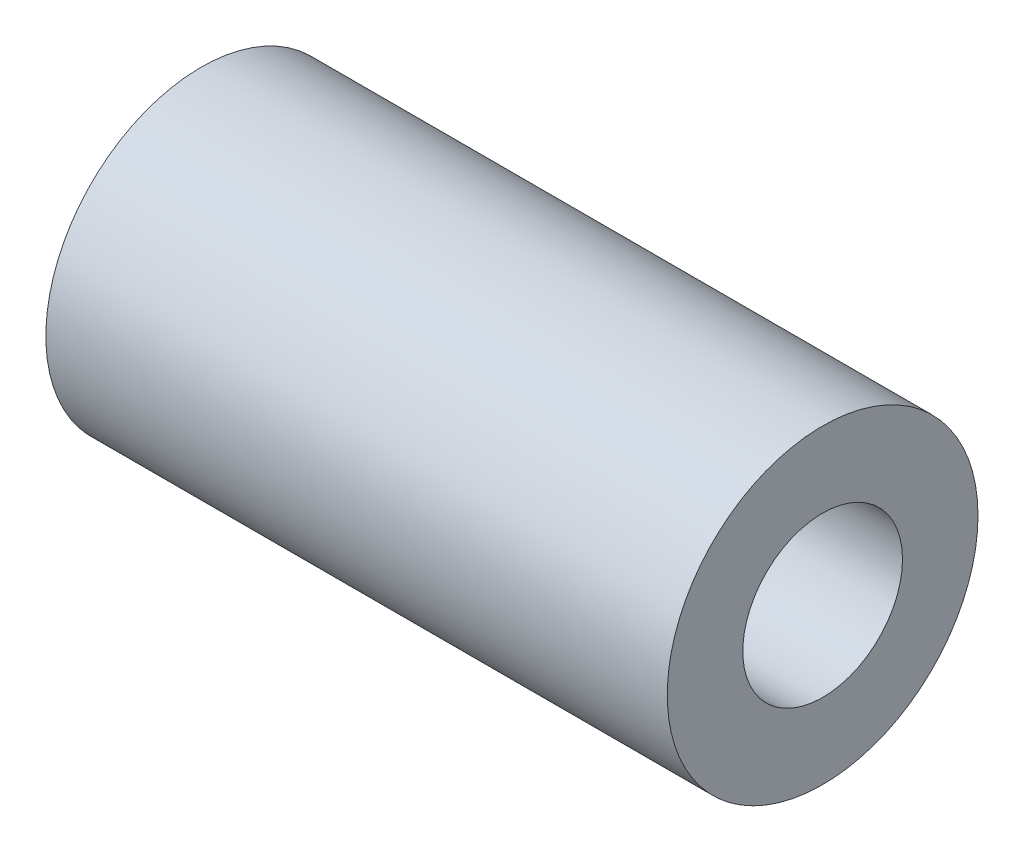
ISO-10303-21;
HEADER;
FILE_DESCRIPTION(('STEP AP214'),'2;1');
FILE_NAME('part.step','',(''),(''),'','','');
FILE_SCHEMA(('AUTOMOTIVE_DESIGN { 1 0 10303 214 1 1 1 1 }'));
ENDSEC;
DATA;
#1=APPLICATION_CONTEXT('core data for automotive mechanical design processes');
#2=APPLICATION_PROTOCOL_DEFINITION('international standard','automotive_design',2000,#1);
#3=PRODUCT_CONTEXT('',#1,'mechanical');
#4=PRODUCT('Part','Part','',(#3));
#5=PRODUCT_RELATED_PRODUCT_CATEGORY('part','',(#4));
#6=PRODUCT_DEFINITION_FORMATION('','',#4);
#7=PRODUCT_DEFINITION_CONTEXT('part definition',#1,'design');
#8=PRODUCT_DEFINITION('design','',#6,#7);
#9=PRODUCT_DEFINITION_SHAPE('','',#8);
#10=(LENGTH_UNIT() NAMED_UNIT(*) SI_UNIT(.MILLI.,.METRE.));
#11=(NAMED_UNIT(*) PLANE_ANGLE_UNIT() SI_UNIT($,.RADIAN.));
#12=(NAMED_UNIT(*) SI_UNIT($,.STERADIAN.) SOLID_ANGLE_UNIT());
#13=UNCERTAINTY_MEASURE_WITH_UNIT(LENGTH_MEASURE(1.E-05),#10,'distance_accuracy_value','');
#14=(GEOMETRIC_REPRESENTATION_CONTEXT(3) GLOBAL_UNCERTAINTY_ASSIGNED_CONTEXT((#13)) GLOBAL_UNIT_ASSIGNED_CONTEXT((#10,
#11,#12)) REPRESENTATION_CONTEXT('',''));
#15=CARTESIAN_POINT('',(0.,0.,0.));
#16=DIRECTION('',(0.,0.,1.));
#17=DIRECTION('',(1.,0.,0.));
#18=AXIS2_PLACEMENT_3D('',#15,#16,#17);
#19=CARTESIAN_POINT('',(25.4,0.,0.));
#20=DIRECTION('',(1.,0.,0.));
#21=DIRECTION('',(0.,0.,-1.));
#22=AXIS2_PLACEMENT_3D('',#19,#20,#21);
#23=PLANE('',#22);
#24=CARTESIAN_POINT('',(25.4,0.,0.));
#25=DIRECTION('',(1.,0.,0.));
#26=DIRECTION('',(0.,0.,-1.));
#27=AXIS2_PLACEMENT_3D('',#24,#25,#26);
#28=CIRCLE('',#27,6.35);
#29=CARTESIAN_POINT('',(25.4,0.,-6.35));
#30=VERTEX_POINT('',#29);
#31=EDGE_CURVE('E10',#30,#30,#28,.T.);
#32=ORIENTED_EDGE('',*,*,#31,.T.);
#33=EDGE_LOOP('',(#32));
#34=FACE_BOUND('',#33,.T.);
#35=CARTESIAN_POINT('',(25.4,0.,0.));
#36=DIRECTION('',(1.,0.,0.));
#37=DIRECTION('',(0.,0.,-1.));
#38=AXIS2_PLACEMENT_3D('',#35,#36,#37);
#39=CIRCLE('',#38,3.2639);
#40=CARTESIAN_POINT('',(25.4,0.,-3.2639));
#41=VERTEX_POINT('',#40);
#42=EDGE_CURVE('E41',#41,#41,#39,.T.);
#43=ORIENTED_EDGE('',*,*,#42,.F.);
#44=EDGE_LOOP('',(#43));
#45=FACE_BOUND('',#44,.T.);
#46=ADVANCED_FACE('F30',(#34,#45),#23,.T.);
#47=CARTESIAN_POINT('',(0.,0.,0.));
#48=DIRECTION('',(1.,0.,0.));
#49=DIRECTION('',(0.,0.,-1.));
#50=AXIS2_PLACEMENT_3D('',#47,#48,#49);
#51=PLANE('',#50);
#52=CARTESIAN_POINT('',(0.,0.,0.));
#53=DIRECTION('',(1.,0.,0.));
#54=DIRECTION('',(0.,0.,-1.));
#55=AXIS2_PLACEMENT_3D('',#52,#53,#54);
#56=CIRCLE('',#55,6.35);
#57=CARTESIAN_POINT('',(0.,0.,-6.35));
#58=VERTEX_POINT('',#57);
#59=EDGE_CURVE('E34',#58,#58,#56,.T.);
#60=ORIENTED_EDGE('',*,*,#59,.F.);
#61=EDGE_LOOP('',(#60));
#62=FACE_BOUND('',#61,.T.);
#63=CARTESIAN_POINT('',(0.,0.,0.));
#64=DIRECTION('',(1.,0.,0.));
#65=DIRECTION('',(0.,0.,-1.));
#66=AXIS2_PLACEMENT_3D('',#63,#64,#65);
#67=CIRCLE('',#66,3.2639);
#68=CARTESIAN_POINT('',(0.,0.,-3.2639));
#69=VERTEX_POINT('',#68);
#70=EDGE_CURVE('E43',#69,#69,#67,.T.);
#71=ORIENTED_EDGE('',*,*,#70,.T.);
#72=EDGE_LOOP('',(#71));
#73=FACE_BOUND('',#72,.T.);
#74=ADVANCED_FACE('F53',(#62,#73),#51,.F.);
#75=CARTESIAN_POINT('',(25.4,0.,0.));
#76=DIRECTION('',(-1.,0.,0.));
#77=DIRECTION('',(0.,0.,1.));
#78=AXIS2_PLACEMENT_3D('',#75,#76,#77);
#79=CYLINDRICAL_SURFACE('',#78,6.35);
#80=ORIENTED_EDGE('',*,*,#31,.F.);
#81=EDGE_LOOP('',(#80));
#82=FACE_BOUND('',#81,.T.);
#83=ORIENTED_EDGE('',*,*,#59,.T.);
#84=EDGE_LOOP('',(#83));
#85=FACE_BOUND('',#84,.T.);
#86=ADVANCED_FACE('F32',(#82,#85),#79,.T.);
#87=CARTESIAN_POINT('',(25.4,0.,0.));
#88=DIRECTION('',(-1.,0.,0.));
#89=DIRECTION('',(0.,0.,1.));
#90=AXIS2_PLACEMENT_3D('',#87,#88,#89);
#91=CYLINDRICAL_SURFACE('',#90,3.2639);
#92=ORIENTED_EDGE('',*,*,#42,.T.);
#93=EDGE_LOOP('',(#92));
#94=FACE_BOUND('',#93,.T.);
#95=ORIENTED_EDGE('',*,*,#70,.F.);
#96=EDGE_LOOP('',(#95));
#97=FACE_BOUND('',#96,.T.);
#98=ADVANCED_FACE('F49',(#94,#97),#91,.F.);
#99=CLOSED_SHELL('',(#46,#74,#86,#98));
#100=MANIFOLD_SOLID_BREP('B2',#99);
#101=ADVANCED_BREP_SHAPE_REPRESENTATION('',(#18,#100),#14);
#102=SHAPE_DEFINITION_REPRESENTATION(#9,#101);
ENDSEC;
END-ISO-10303-21;
